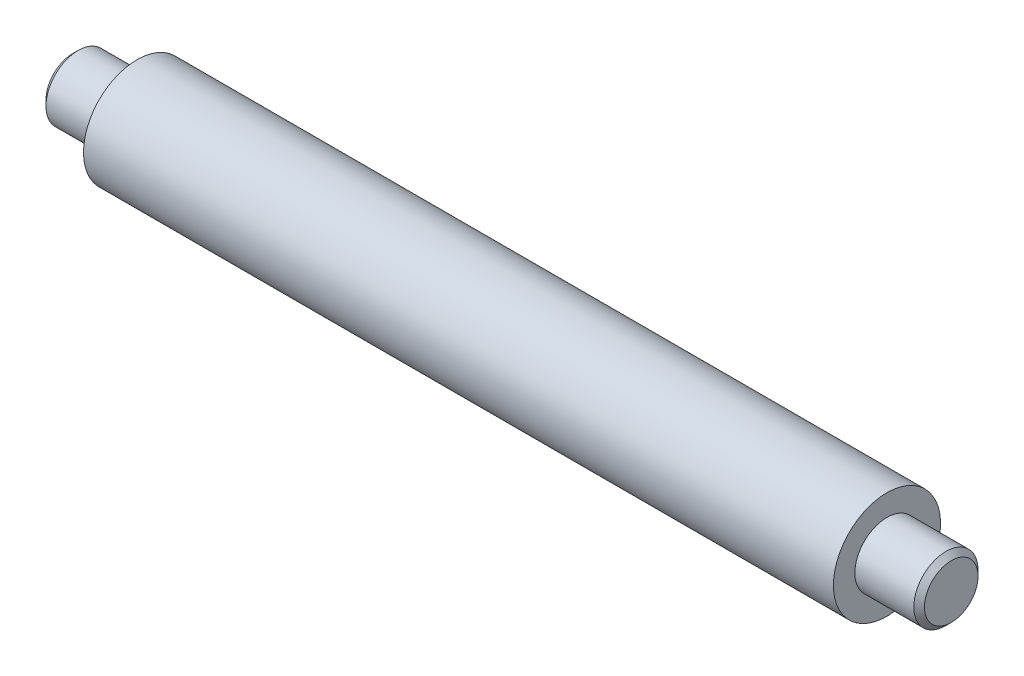
ISO-10303-21;
HEADER;
FILE_DESCRIPTION(('STEP AP214'),'2;1');
FILE_NAME('part.step','',(''),(''),'','','');
FILE_SCHEMA(('AUTOMOTIVE_DESIGN { 1 0 10303 214 1 1 1 1 }'));
ENDSEC;
DATA;
#1=APPLICATION_CONTEXT('core data for automotive mechanical design processes');
#2=APPLICATION_PROTOCOL_DEFINITION('international standard','automotive_design',2000,#1);
#3=PRODUCT_CONTEXT('',#1,'mechanical');
#4=PRODUCT('Part','Part','',(#3));
#5=PRODUCT_RELATED_PRODUCT_CATEGORY('part','',(#4));
#6=PRODUCT_DEFINITION_FORMATION('','',#4);
#7=PRODUCT_DEFINITION_CONTEXT('part definition',#1,'design');
#8=PRODUCT_DEFINITION('design','',#6,#7);
#9=PRODUCT_DEFINITION_SHAPE('','',#8);
#10=(LENGTH_UNIT() NAMED_UNIT(*) SI_UNIT(.MILLI.,.METRE.));
#11=(NAMED_UNIT(*) PLANE_ANGLE_UNIT() SI_UNIT($,.RADIAN.));
#12=(NAMED_UNIT(*) SI_UNIT($,.STERADIAN.) SOLID_ANGLE_UNIT());
#13=UNCERTAINTY_MEASURE_WITH_UNIT(LENGTH_MEASURE(1.E-05),#10,'distance_accuracy_value','');
#14=(GEOMETRIC_REPRESENTATION_CONTEXT(3) GLOBAL_UNCERTAINTY_ASSIGNED_CONTEXT((#13)) GLOBAL_UNIT_ASSIGNED_CONTEXT((#10,
#11,#12)) REPRESENTATION_CONTEXT('',''));
#15=CARTESIAN_POINT('',(0.,0.,0.));
#16=DIRECTION('',(0.,0.,1.));
#17=DIRECTION('',(1.,0.,0.));
#18=AXIS2_PLACEMENT_3D('',#15,#16,#17);
#19=CARTESIAN_POINT('',(-20.5,0.,0.));
#20=DIRECTION('',(1.,0.,0.));
#21=DIRECTION('',(0.,0.,-1.));
#22=AXIS2_PLACEMENT_3D('',#19,#20,#21);
#23=PLANE('',#22);
#24=CARTESIAN_POINT('',(-20.5,0.,0.));
#25=DIRECTION('',(1.,0.,0.));
#26=DIRECTION('',(0.,0.,-1.));
#27=AXIS2_PLACEMENT_3D('',#24,#25,#26);
#28=CIRCLE('',#27,1.25);
#29=CARTESIAN_POINT('',(-20.5,0.,-1.25));
#30=VERTEX_POINT('',#29);
#31=EDGE_CURVE('E66',#30,#30,#28,.F.);
#32=ORIENTED_EDGE('',*,*,#31,.T.);
#33=EDGE_LOOP('',(#32));
#34=FACE_BOUND('',#33,.T.);
#35=ADVANCED_FACE('F47',(#34),#23,.F.);
#36=CARTESIAN_POINT('',(-39.7757572103816,0.,0.));
#37=DIRECTION('',(-1.,0.,0.));
#38=DIRECTION('',(0.,0.,1.));
#39=AXIS2_PLACEMENT_3D('',#36,#37,#38);
#40=CYLINDRICAL_SURFACE('',#39,1.5);
#41=CARTESIAN_POINT('',(-20.25,0.,0.));
#42=DIRECTION('',(1.,0.,0.));
#43=DIRECTION('',(0.,0.,-1.));
#44=AXIS2_PLACEMENT_3D('',#41,#42,#43);
#45=CIRCLE('',#44,1.5);
#46=CARTESIAN_POINT('',(-20.25,0.,-1.5));
#47=VERTEX_POINT('',#46);
#48=EDGE_CURVE('E61',#47,#47,#45,.T.);
#49=ORIENTED_EDGE('',*,*,#48,.T.);
#50=EDGE_LOOP('',(#49));
#51=FACE_BOUND('',#50,.T.);
#52=CARTESIAN_POINT('',(-17.5,0.,0.));
#53=DIRECTION('',(-1.,0.,0.));
#54=DIRECTION('',(0.,0.,1.));
#55=AXIS2_PLACEMENT_3D('',#52,#53,#54);
#56=CIRCLE('',#55,1.5);
#57=CARTESIAN_POINT('',(-17.5,0.,1.5));
#58=VERTEX_POINT('',#57);
#59=EDGE_CURVE('E72',#58,#58,#56,.T.);
#60=ORIENTED_EDGE('',*,*,#59,.T.);
#61=EDGE_LOOP('',(#60));
#62=FACE_BOUND('',#61,.T.);
#63=ADVANCED_FACE('F105',(#51,#62),#40,.T.);
#64=CARTESIAN_POINT('',(-17.5,1.5,0.));
#65=DIRECTION('',(1.,0.,0.));
#66=DIRECTION('',(0.,0.,-1.));
#67=AXIS2_PLACEMENT_3D('',#64,#65,#66);
#68=PLANE('',#67);
#69=ORIENTED_EDGE('',*,*,#59,.F.);
#70=EDGE_LOOP('',(#69));
#71=FACE_BOUND('',#70,.T.);
#72=CARTESIAN_POINT('',(-17.5,0.,0.));
#73=DIRECTION('',(-1.,0.,0.));
#74=DIRECTION('',(0.,0.,1.));
#75=AXIS2_PLACEMENT_3D('',#72,#73,#74);
#76=CIRCLE('',#75,2.5);
#77=CARTESIAN_POINT('',(-17.5,0.,2.5));
#78=VERTEX_POINT('',#77);
#79=EDGE_CURVE('E76',#78,#78,#76,.T.);
#80=ORIENTED_EDGE('',*,*,#79,.T.);
#81=EDGE_LOOP('',(#80));
#82=FACE_BOUND('',#81,.T.);
#83=ADVANCED_FACE('F111',(#71,#82),#68,.F.);
#84=CARTESIAN_POINT('',(-39.7757572103816,0.,0.));
#85=DIRECTION('',(-1.,0.,0.));
#86=DIRECTION('',(0.,0.,1.));
#87=AXIS2_PLACEMENT_3D('',#84,#85,#86);
#88=CYLINDRICAL_SURFACE('',#87,2.5);
#89=ORIENTED_EDGE('',*,*,#79,.F.);
#90=EDGE_LOOP('',(#89));
#91=FACE_BOUND('',#90,.T.);
#92=CARTESIAN_POINT('',(17.5,0.,0.));
#93=DIRECTION('',(-1.,0.,0.));
#94=DIRECTION('',(0.,0.,1.));
#95=AXIS2_PLACEMENT_3D('',#92,#93,#94);
#96=CIRCLE('',#95,2.5);
#97=CARTESIAN_POINT('',(17.5,0.,2.5));
#98=VERTEX_POINT('',#97);
#99=EDGE_CURVE('E80',#98,#98,#96,.T.);
#100=ORIENTED_EDGE('',*,*,#99,.T.);
#101=EDGE_LOOP('',(#100));
#102=FACE_BOUND('',#101,.T.);
#103=ADVANCED_FACE('F101',(#91,#102),#88,.T.);
#104=CARTESIAN_POINT('',(17.5,2.5,0.));
#105=DIRECTION('',(-1.,0.,0.));
#106=DIRECTION('',(0.,0.,1.));
#107=AXIS2_PLACEMENT_3D('',#104,#105,#106);
#108=PLANE('',#107);
#109=ORIENTED_EDGE('',*,*,#99,.F.);
#110=EDGE_LOOP('',(#109));
#111=FACE_BOUND('',#110,.T.);
#112=CARTESIAN_POINT('',(17.5,0.,0.));
#113=DIRECTION('',(-1.,0.,0.));
#114=DIRECTION('',(0.,0.,1.));
#115=AXIS2_PLACEMENT_3D('',#112,#113,#114);
#116=CIRCLE('',#115,1.5);
#117=CARTESIAN_POINT('',(17.5,0.,1.5));
#118=VERTEX_POINT('',#117);
#119=EDGE_CURVE('E84',#118,#118,#116,.T.);
#120=ORIENTED_EDGE('',*,*,#119,.T.);
#121=EDGE_LOOP('',(#120));
#122=FACE_BOUND('',#121,.T.);
#123=ADVANCED_FACE('F89',(#111,#122),#108,.F.);
#124=CARTESIAN_POINT('',(-39.7757572103816,0.,0.));
#125=DIRECTION('',(-1.,0.,0.));
#126=DIRECTION('',(0.,0.,1.));
#127=AXIS2_PLACEMENT_3D('',#124,#125,#126);
#128=CYLINDRICAL_SURFACE('',#127,1.5);
#129=CARTESIAN_POINT('',(20.25,0.,0.));
#130=DIRECTION('',(-1.,0.,0.));
#131=DIRECTION('',(0.,0.,1.));
#132=AXIS2_PLACEMENT_3D('',#129,#130,#131);
#133=CIRCLE('',#132,1.5);
#134=CARTESIAN_POINT('',(20.25,0.,1.5));
#135=VERTEX_POINT('',#134);
#136=EDGE_CURVE('E56',#135,#135,#133,.T.);
#137=ORIENTED_EDGE('',*,*,#136,.T.);
#138=EDGE_LOOP('',(#137));
#139=FACE_BOUND('',#138,.T.);
#140=ORIENTED_EDGE('',*,*,#119,.F.);
#141=EDGE_LOOP('',(#140));
#142=FACE_BOUND('',#141,.T.);
#143=ADVANCED_FACE('F91',(#139,#142),#128,.T.);
#144=CARTESIAN_POINT('',(20.5,1.5,0.));
#145=DIRECTION('',(-1.,0.,0.));
#146=DIRECTION('',(0.,0.,1.));
#147=AXIS2_PLACEMENT_3D('',#144,#145,#146);
#148=PLANE('',#147);
#149=CARTESIAN_POINT('',(20.5,0.,0.));
#150=DIRECTION('',(-1.,0.,0.));
#151=DIRECTION('',(0.,0.,1.));
#152=AXIS2_PLACEMENT_3D('',#149,#150,#151);
#153=CIRCLE('',#152,1.25);
#154=CARTESIAN_POINT('',(20.5,0.,1.25));
#155=VERTEX_POINT('',#154);
#156=EDGE_CURVE('E10',#155,#155,#153,.F.);
#157=ORIENTED_EDGE('',*,*,#156,.T.);
#158=EDGE_LOOP('',(#157));
#159=FACE_BOUND('',#158,.T.);
#160=ADVANCED_FACE('F93',(#159),#148,.F.);
#161=CARTESIAN_POINT('',(-20.5,0.,0.));
#162=DIRECTION('',(1.,0.,0.));
#163=DIRECTION('',(0.,0.,-1.));
#164=AXIS2_PLACEMENT_3D('',#161,#162,#163);
#165=CONICAL_SURFACE('',#164,1.25,0.785398163397453);
#166=ORIENTED_EDGE('',*,*,#48,.F.);
#167=EDGE_LOOP('',(#166));
#168=FACE_BOUND('',#167,.T.);
#169=ORIENTED_EDGE('',*,*,#31,.F.);
#170=EDGE_LOOP('',(#169));
#171=FACE_BOUND('',#170,.T.);
#172=ADVANCED_FACE('F99',(#168,#171),#165,.T.);
#173=CARTESIAN_POINT('',(20.25,0.,0.));
#174=DIRECTION('',(-1.,0.,0.));
#175=DIRECTION('',(0.,0.,1.));
#176=AXIS2_PLACEMENT_3D('',#173,#174,#175);
#177=CONICAL_SURFACE('',#176,1.5,0.785398163397454);
#178=ORIENTED_EDGE('',*,*,#156,.F.);
#179=EDGE_LOOP('',(#178));
#180=FACE_BOUND('',#179,.T.);
#181=ORIENTED_EDGE('',*,*,#136,.F.);
#182=EDGE_LOOP('',(#181));
#183=FACE_BOUND('',#182,.T.);
#184=ADVANCED_FACE('F50',(#180,#183),#177,.T.);
#185=CLOSED_SHELL('',(#35,#63,#83,#103,#123,#143,#160,#172,#184));
#186=MANIFOLD_SOLID_BREP('B2',#185);
#187=ADVANCED_BREP_SHAPE_REPRESENTATION('',(#18,#186),#14);
#188=SHAPE_DEFINITION_REPRESENTATION(#9,#187);
ENDSEC;
END-ISO-10303-21;
